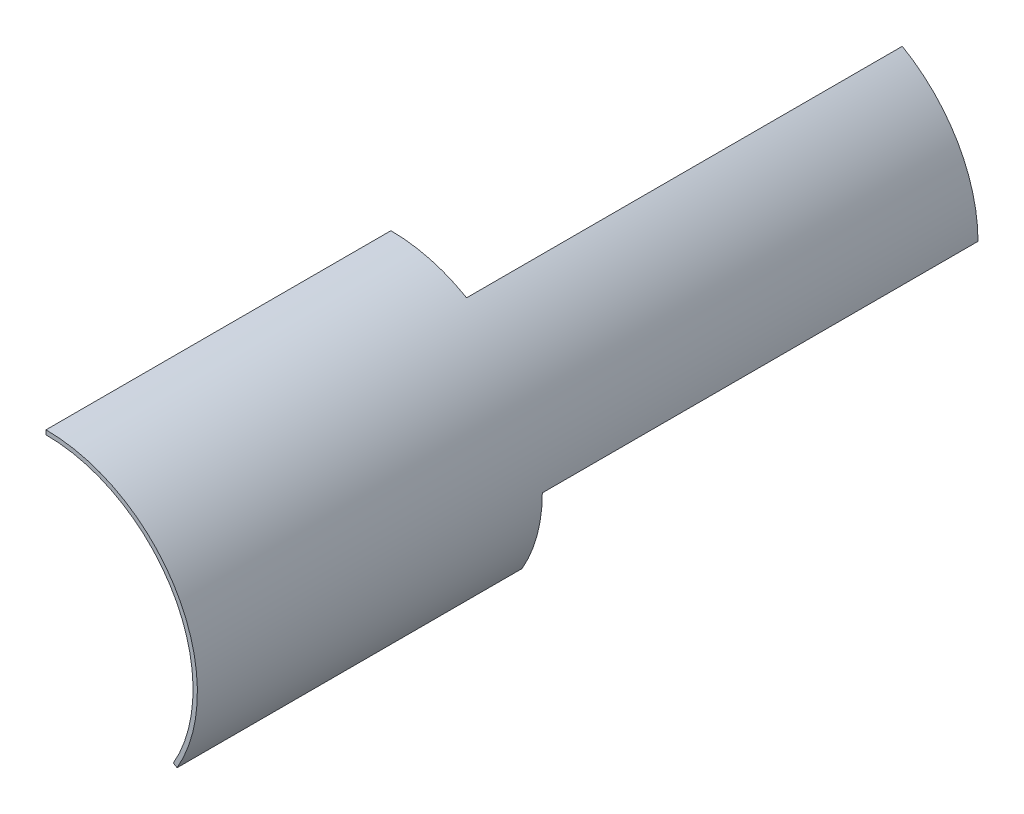
ISO-10303-21;
HEADER;
FILE_DESCRIPTION(('STEP AP214'),'2;1');
FILE_NAME('part.step','',(''),(''),'','','');
FILE_SCHEMA(('AUTOMOTIVE_DESIGN { 1 0 10303 214 1 1 1 1 }'));
ENDSEC;
DATA;
#1=APPLICATION_CONTEXT('core data for automotive mechanical design processes');
#2=APPLICATION_PROTOCOL_DEFINITION('international standard','automotive_design',2000,#1);
#3=PRODUCT_CONTEXT('',#1,'mechanical');
#4=PRODUCT('Part','Part','',(#3));
#5=PRODUCT_RELATED_PRODUCT_CATEGORY('part','',(#4));
#6=PRODUCT_DEFINITION_FORMATION('','',#4);
#7=PRODUCT_DEFINITION_CONTEXT('part definition',#1,'design');
#8=PRODUCT_DEFINITION('design','',#6,#7);
#9=PRODUCT_DEFINITION_SHAPE('','',#8);
#10=(LENGTH_UNIT() NAMED_UNIT(*) SI_UNIT(.MILLI.,.METRE.));
#11=(NAMED_UNIT(*) PLANE_ANGLE_UNIT() SI_UNIT($,.RADIAN.));
#12=(NAMED_UNIT(*) SI_UNIT($,.STERADIAN.) SOLID_ANGLE_UNIT());
#13=UNCERTAINTY_MEASURE_WITH_UNIT(LENGTH_MEASURE(1.E-05),#10,'distance_accuracy_value','');
#14=(GEOMETRIC_REPRESENTATION_CONTEXT(3) GLOBAL_UNCERTAINTY_ASSIGNED_CONTEXT((#13)) GLOBAL_UNIT_ASSIGNED_CONTEXT((#10,
#11,#12)) REPRESENTATION_CONTEXT('',''));
#15=CARTESIAN_POINT('',(0.,0.,0.));
#16=DIRECTION('',(0.,0.,1.));
#17=DIRECTION('',(1.,0.,0.));
#18=AXIS2_PLACEMENT_3D('',#15,#16,#17);
#19=CARTESIAN_POINT('',(35.0740288532697,-20.2500000000002,-95.));
#20=DIRECTION('',(0.,0.,1.));
#21=DIRECTION('',(1.,0.,0.));
#22=AXIS2_PLACEMENT_3D('',#19,#20,#21);
#23=PLANE('',#22);
#24=DIRECTION('',(-1.,0.,0.));
#25=VECTOR('',#24,1.);
#26=CARTESIAN_POINT('',(41.7,-1.45716771982052E-13,-95.));
#27=LINE('',#26,#25);
#28=CARTESIAN_POINT('',(41.7,-1.45716771982052E-13,-95.));
#29=VERTEX_POINT('',#28);
#30=CARTESIAN_POINT('',(40.5,-1.38777878078145E-13,-95.));
#31=VERTEX_POINT('',#30);
#32=EDGE_CURVE('E101',#29,#31,#27,.T.);
#33=ORIENTED_EDGE('',*,*,#32,.F.);
#34=CARTESIAN_POINT('',(0.,0.,-95.));
#35=DIRECTION('',(0.,0.,1.));
#36=DIRECTION('',(1.,0.,0.));
#37=AXIS2_PLACEMENT_3D('',#34,#35,#36);
#38=CIRCLE('',#37,41.7);
#39=CARTESIAN_POINT('',(36.113259337811,-20.8500000000002,-95.));
#40=VERTEX_POINT('',#39);
#41=EDGE_CURVE('E58',#40,#29,#38,.T.);
#42=ORIENTED_EDGE('',*,*,#41,.F.);
#43=DIRECTION('',(0.866025403784436,-0.500000000000004,0.));
#44=VECTOR('',#43,1.);
#45=CARTESIAN_POINT('',(35.0740288532697,-20.2500000000002,-95.));
#46=LINE('',#45,#44);
#47=CARTESIAN_POINT('',(35.0740288532697,-20.2500000000002,-95.));
#48=VERTEX_POINT('',#47);
#49=EDGE_CURVE('E119',#48,#40,#46,.T.);
#50=ORIENTED_EDGE('',*,*,#49,.F.);
#51=CARTESIAN_POINT('',(0.,0.,-95.));
#52=DIRECTION('',(0.,0.,1.));
#53=DIRECTION('',(1.,0.,0.));
#54=AXIS2_PLACEMENT_3D('',#51,#52,#53);
#55=CIRCLE('',#54,40.5);
#56=EDGE_CURVE('E114',#48,#31,#55,.T.);
#57=ORIENTED_EDGE('',*,*,#56,.T.);
#58=EDGE_LOOP('',(#33,#42,#50,#57));
#59=FACE_BOUND('',#58,.T.);
#60=ADVANCED_FACE('F33',(#59),#23,.F.);
#61=CARTESIAN_POINT('',(0.,0.,0.));
#62=DIRECTION('',(0.,0.,1.));
#63=DIRECTION('',(1.,0.,0.));
#64=AXIS2_PLACEMENT_3D('',#61,#62,#63);
#65=CYLINDRICAL_SURFACE('',#64,41.7);
#66=CARTESIAN_POINT('',(0.,0.,0.));
#67=DIRECTION('',(0.,0.,1.));
#68=DIRECTION('',(1.,0.,0.));
#69=AXIS2_PLACEMENT_3D('',#66,#67,#68);
#70=CIRCLE('',#69,41.7);
#71=CARTESIAN_POINT('',(36.113259337811,-20.8500000000002,0.));
#72=VERTEX_POINT('',#71);
#73=CARTESIAN_POINT('',(0.,41.7,0.));
#74=VERTEX_POINT('',#73);
#75=EDGE_CURVE('E11',#72,#74,#70,.T.);
#76=ORIENTED_EDGE('',*,*,#75,.F.);
#77=DIRECTION('',(0.,0.,1.));
#78=VECTOR('',#77,1.);
#79=CARTESIAN_POINT('',(36.113259337811,-20.8500000000002,-95.));
#80=LINE('',#79,#78);
#81=EDGE_CURVE('E146',#40,#72,#80,.T.);
#82=ORIENTED_EDGE('',*,*,#81,.F.);
#83=ORIENTED_EDGE('',*,*,#41,.T.);
#84=DIRECTION('',(0.,0.,1.));
#85=VECTOR('',#84,1.);
#86=CARTESIAN_POINT('',(41.7,-1.42247325030098E-13,-215.));
#87=LINE('',#86,#85);
#88=CARTESIAN_POINT('',(41.7,-1.42247325030098E-13,-215.));
#89=VERTEX_POINT('',#88);
#90=EDGE_CURVE('E108',#89,#29,#87,.T.);
#91=ORIENTED_EDGE('',*,*,#90,.F.);
#92=CARTESIAN_POINT('',(0.,0.,-215.));
#93=DIRECTION('',(0.,0.,-1.));
#94=DIRECTION('',(-1.,0.,0.));
#95=AXIS2_PLACEMENT_3D('',#92,#93,#94);
#96=CIRCLE('',#95,41.7);
#97=CARTESIAN_POINT('',(20.8500000000001,36.1132593378111,-215.));
#98=VERTEX_POINT('',#97);
#99=EDGE_CURVE('E162',#98,#89,#96,.T.);
#100=ORIENTED_EDGE('',*,*,#99,.F.);
#101=DIRECTION('',(0.,0.,1.));
#102=VECTOR('',#101,1.);
#103=CARTESIAN_POINT('',(20.8500000000001,36.1132593378111,-215.));
#104=LINE('',#103,#102);
#105=CARTESIAN_POINT('',(20.8500000000001,36.1132593378111,-95.));
#106=VERTEX_POINT('',#105);
#107=EDGE_CURVE('E164',#98,#106,#104,.T.);
#108=ORIENTED_EDGE('',*,*,#107,.T.);
#109=CARTESIAN_POINT('',(0.,41.7,-95.));
#110=VERTEX_POINT('',#109);
#111=EDGE_CURVE('E134',#106,#110,#38,.T.);
#112=ORIENTED_EDGE('',*,*,#111,.T.);
#113=DIRECTION('',(0.,0.,1.));
#114=VECTOR('',#113,1.);
#115=CARTESIAN_POINT('',(0.,41.7,-95.));
#116=LINE('',#115,#114);
#117=EDGE_CURVE('E159',#110,#74,#116,.T.);
#118=ORIENTED_EDGE('',*,*,#117,.T.);
#119=EDGE_LOOP('',(#76,#82,#83,#91,#100,#108,#112,#118));
#120=FACE_BOUND('',#119,.T.);
#121=ADVANCED_FACE('F183',(#120),#65,.T.);
#122=CARTESIAN_POINT('',(36.113259337811,-20.8500000000002,0.));
#123=DIRECTION('',(0.,0.,-1.));
#124=DIRECTION('',(-1.,0.,0.));
#125=AXIS2_PLACEMENT_3D('',#122,#123,#124);
#126=PLANE('',#125);
#127=CARTESIAN_POINT('',(0.,0.,0.));
#128=DIRECTION('',(0.,0.,1.));
#129=DIRECTION('',(1.,0.,0.));
#130=AXIS2_PLACEMENT_3D('',#127,#128,#129);
#131=CIRCLE('',#130,40.5);
#132=CARTESIAN_POINT('',(35.0740288532697,-20.2500000000002,0.));
#133=VERTEX_POINT('',#132);
#134=CARTESIAN_POINT('',(0.,40.5,0.));
#135=VERTEX_POINT('',#134);
#136=EDGE_CURVE('E42',#133,#135,#131,.T.);
#137=ORIENTED_EDGE('',*,*,#136,.F.);
#138=DIRECTION('',(-0.866025403784436,0.500000000000004,0.));
#139=VECTOR('',#138,1.);
#140=CARTESIAN_POINT('',(36.113259337811,-20.8500000000002,0.));
#141=LINE('',#140,#139);
#142=EDGE_CURVE('E144',#72,#133,#141,.T.);
#143=ORIENTED_EDGE('',*,*,#142,.F.);
#144=ORIENTED_EDGE('',*,*,#75,.T.);
#145=DIRECTION('',(0.,-1.,0.));
#146=VECTOR('',#145,1.);
#147=CARTESIAN_POINT('',(0.,41.7,0.));
#148=LINE('',#147,#146);
#149=EDGE_CURVE('E156',#74,#135,#148,.T.);
#150=ORIENTED_EDGE('',*,*,#149,.T.);
#151=EDGE_LOOP('',(#137,#143,#144,#150));
#152=FACE_BOUND('',#151,.T.);
#153=ADVANCED_FACE('F35',(#152),#126,.F.);
#154=CARTESIAN_POINT('',(0.,0.,0.));
#155=DIRECTION('',(0.,0.,1.));
#156=DIRECTION('',(1.,0.,0.));
#157=AXIS2_PLACEMENT_3D('',#154,#155,#156);
#158=CYLINDRICAL_SURFACE('',#157,40.5);
#159=ORIENTED_EDGE('',*,*,#56,.F.);
#160=DIRECTION('',(0.,0.,-1.));
#161=VECTOR('',#160,1.);
#162=CARTESIAN_POINT('',(35.0740288532697,-20.2500000000002,0.));
#163=LINE('',#162,#161);
#164=EDGE_CURVE('E141',#133,#48,#163,.T.);
#165=ORIENTED_EDGE('',*,*,#164,.F.);
#166=ORIENTED_EDGE('',*,*,#136,.T.);
#167=DIRECTION('',(0.,0.,-1.));
#168=VECTOR('',#167,1.);
#169=CARTESIAN_POINT('',(0.,40.5,0.));
#170=LINE('',#169,#168);
#171=CARTESIAN_POINT('',(0.,40.5,-95.));
#172=VERTEX_POINT('',#171);
#173=EDGE_CURVE('E153',#135,#172,#170,.T.);
#174=ORIENTED_EDGE('',*,*,#173,.T.);
#175=CARTESIAN_POINT('',(20.25,35.0740288532697,-95.));
#176=VERTEX_POINT('',#175);
#177=EDGE_CURVE('E120',#176,#172,#55,.T.);
#178=ORIENTED_EDGE('',*,*,#177,.F.);
#179=DIRECTION('',(0.,0.,-1.));
#180=VECTOR('',#179,1.);
#181=CARTESIAN_POINT('',(20.25,35.0740288532698,-95.));
#182=LINE('',#181,#180);
#183=CARTESIAN_POINT('',(20.2500000000001,35.0740288532698,-215.));
#184=VERTEX_POINT('',#183);
#185=EDGE_CURVE('E50',#176,#184,#182,.T.);
#186=ORIENTED_EDGE('',*,*,#185,.T.);
#187=CARTESIAN_POINT('',(0.,0.,-215.));
#188=DIRECTION('',(0.,0.,-1.));
#189=DIRECTION('',(-1.,0.,0.));
#190=AXIS2_PLACEMENT_3D('',#187,#188,#189);
#191=CIRCLE('',#190,40.5);
#192=CARTESIAN_POINT('',(40.5,-1.38777878078145E-13,-215.));
#193=VERTEX_POINT('',#192);
#194=EDGE_CURVE('E116',#184,#193,#191,.T.);
#195=ORIENTED_EDGE('',*,*,#194,.T.);
#196=DIRECTION('',(0.,0.,-1.));
#197=VECTOR('',#196,1.);
#198=CARTESIAN_POINT('',(40.5,-1.38777878078145E-13,-95.));
#199=LINE('',#198,#197);
#200=EDGE_CURVE('E105',#31,#193,#199,.T.);
#201=ORIENTED_EDGE('',*,*,#200,.F.);
#202=EDGE_LOOP('',(#159,#165,#166,#174,#178,#186,#195,#201));
#203=FACE_BOUND('',#202,.T.);
#204=ADVANCED_FACE('F112',(#203),#158,.F.);
#205=ORIENTED_EDGE('',*,*,#111,.F.);
#206=DIRECTION('',(-0.500000000000004,-0.866025403784436,0.));
#207=VECTOR('',#206,1.);
#208=CARTESIAN_POINT('',(20.8500000000001,36.1132593378111,-95.));
#209=LINE('',#208,#207);
#210=EDGE_CURVE('E172',#106,#176,#209,.T.);
#211=ORIENTED_EDGE('',*,*,#210,.T.);
#212=ORIENTED_EDGE('',*,*,#177,.T.);
#213=DIRECTION('',(0.,1.,0.));
#214=VECTOR('',#213,1.);
#215=CARTESIAN_POINT('',(0.,40.5,-95.));
#216=LINE('',#215,#214);
#217=EDGE_CURVE('E150',#172,#110,#216,.T.);
#218=ORIENTED_EDGE('',*,*,#217,.T.);
#219=EDGE_LOOP('',(#205,#211,#212,#218));
#220=FACE_BOUND('',#219,.T.);
#221=ADVANCED_FACE('F189',(#220),#23,.F.);
#222=CARTESIAN_POINT('',(0.,0.,0.));
#223=DIRECTION('',(-0.500000000000004,-0.866025403784436,0.));
#224=DIRECTION('',(0.,0.,-1.));
#225=AXIS2_PLACEMENT_3D('',#222,#223,#224);
#226=PLANE('',#225);
#227=ORIENTED_EDGE('',*,*,#81,.T.);
#228=ORIENTED_EDGE('',*,*,#142,.T.);
#229=ORIENTED_EDGE('',*,*,#164,.T.);
#230=ORIENTED_EDGE('',*,*,#49,.T.);
#231=EDGE_LOOP('',(#227,#228,#229,#230));
#232=FACE_BOUND('',#231,.T.);
#233=ADVANCED_FACE('F197',(#232),#226,.T.);
#234=CARTESIAN_POINT('',(0.,0.,0.));
#235=DIRECTION('',(1.,0.,0.));
#236=DIRECTION('',(0.,0.,-1.));
#237=AXIS2_PLACEMENT_3D('',#234,#235,#236);
#238=PLANE('',#237);
#239=ORIENTED_EDGE('',*,*,#117,.F.);
#240=ORIENTED_EDGE('',*,*,#217,.F.);
#241=ORIENTED_EDGE('',*,*,#173,.F.);
#242=ORIENTED_EDGE('',*,*,#149,.F.);
#243=EDGE_LOOP('',(#239,#240,#241,#242));
#244=FACE_BOUND('',#243,.T.);
#245=ADVANCED_FACE('F194',(#244),#238,.F.);
#246=CARTESIAN_POINT('',(20.2500000000001,35.0740288532698,-215.));
#247=DIRECTION('',(0.,0.,-1.));
#248=DIRECTION('',(-1.,0.,0.));
#249=AXIS2_PLACEMENT_3D('',#246,#247,#248);
#250=PLANE('',#249);
#251=ORIENTED_EDGE('',*,*,#99,.T.);
#252=DIRECTION('',(1.,0.,0.));
#253=VECTOR('',#252,1.);
#254=CARTESIAN_POINT('',(40.5,-1.38777878078145E-13,-215.));
#255=LINE('',#254,#253);
#256=EDGE_CURVE('E117',#193,#89,#255,.T.);
#257=ORIENTED_EDGE('',*,*,#256,.F.);
#258=ORIENTED_EDGE('',*,*,#194,.F.);
#259=DIRECTION('',(0.500000000000001,0.866025403784438,0.));
#260=VECTOR('',#259,1.);
#261=CARTESIAN_POINT('',(20.2500000000001,35.0740288532698,-215.));
#262=LINE('',#261,#260);
#263=EDGE_CURVE('E165',#184,#98,#262,.T.);
#264=ORIENTED_EDGE('',*,*,#263,.T.);
#265=EDGE_LOOP('',(#251,#257,#258,#264));
#266=FACE_BOUND('',#265,.T.);
#267=ADVANCED_FACE('F185',(#266),#250,.T.);
#268=CARTESIAN_POINT('',(-1.17817900008721E-13,0.,0.));
#269=DIRECTION('',(0.866025403784436,-0.500000000000004,0.));
#270=DIRECTION('',(0.500000000000004,0.866025403784436,0.));
#271=AXIS2_PLACEMENT_3D('',#268,#269,#270);
#272=PLANE('',#271);
#273=ORIENTED_EDGE('',*,*,#210,.F.);
#274=ORIENTED_EDGE('',*,*,#107,.F.);
#275=ORIENTED_EDGE('',*,*,#263,.F.);
#276=ORIENTED_EDGE('',*,*,#185,.F.);
#277=EDGE_LOOP('',(#273,#274,#275,#276));
#278=FACE_BOUND('',#277,.T.);
#279=ADVANCED_FACE('F186',(#278),#272,.F.);
#280=CARTESIAN_POINT('',(0.,1.36044392570783E-13,0.));
#281=DIRECTION('',(0.,-1.,0.));
#282=DIRECTION('',(1.,0.,0.));
#283=AXIS2_PLACEMENT_3D('',#280,#281,#282);
#284=PLANE('',#283);
#285=ORIENTED_EDGE('',*,*,#32,.T.);
#286=ORIENTED_EDGE('',*,*,#200,.T.);
#287=ORIENTED_EDGE('',*,*,#256,.T.);
#288=ORIENTED_EDGE('',*,*,#90,.T.);
#289=EDGE_LOOP('',(#285,#286,#287,#288));
#290=FACE_BOUND('',#289,.T.);
#291=ADVANCED_FACE('F103',(#290),#284,.T.);
#292=CLOSED_SHELL('',(#60,#121,#153,#204,#221,#233,#245,#267,#279,#291));
#293=MANIFOLD_SOLID_BREP('B2',#292);
#294=ADVANCED_BREP_SHAPE_REPRESENTATION('',(#18,#293),#14);
#295=SHAPE_DEFINITION_REPRESENTATION(#9,#294);
ENDSEC;
END-ISO-10303-21;
